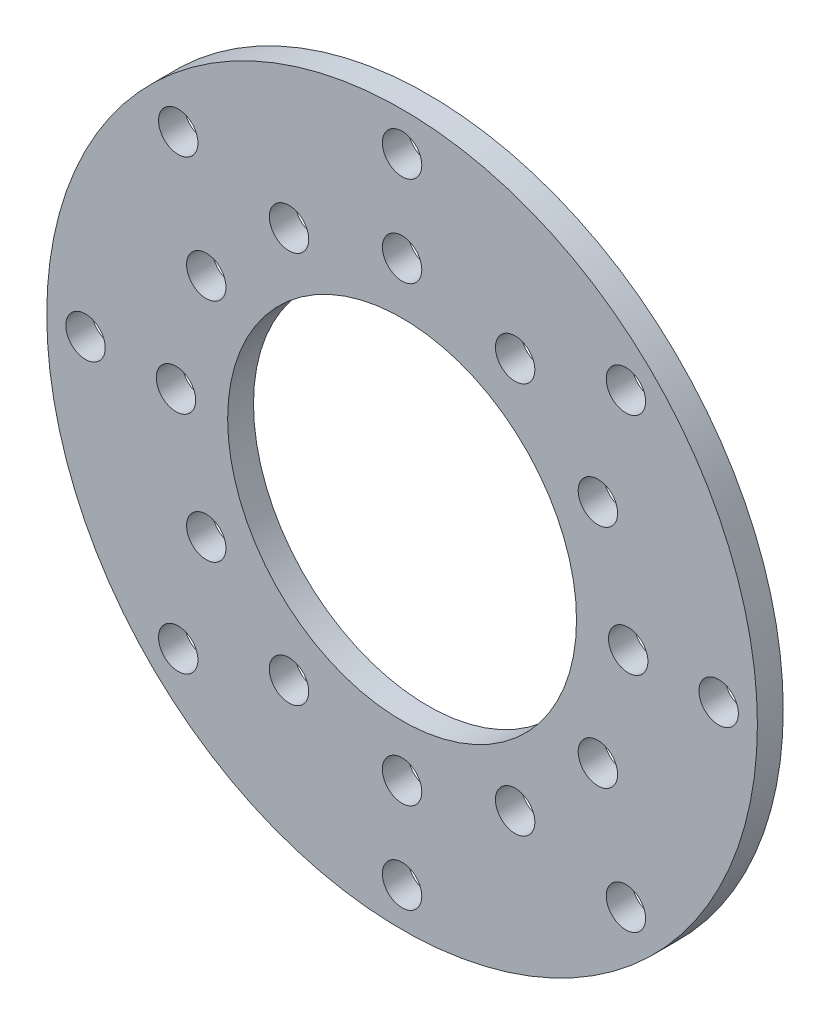
ISO-10303-21;
HEADER;
FILE_DESCRIPTION(('STEP AP214'),'2;1');
FILE_NAME('part.step','',(''),(''),'','','');
FILE_SCHEMA(('AUTOMOTIVE_DESIGN { 1 0 10303 214 1 1 1 1 }'));
ENDSEC;
DATA;
#1=APPLICATION_CONTEXT('core data for automotive mechanical design processes');
#2=APPLICATION_PROTOCOL_DEFINITION('international standard','automotive_design',2000,#1);
#3=PRODUCT_CONTEXT('',#1,'mechanical');
#4=PRODUCT('Part','Part','',(#3));
#5=PRODUCT_RELATED_PRODUCT_CATEGORY('part','',(#4));
#6=PRODUCT_DEFINITION_FORMATION('','',#4);
#7=PRODUCT_DEFINITION_CONTEXT('part definition',#1,'design');
#8=PRODUCT_DEFINITION('design','',#6,#7);
#9=PRODUCT_DEFINITION_SHAPE('','',#8);
#10=(LENGTH_UNIT() NAMED_UNIT(*) SI_UNIT(.MILLI.,.METRE.));
#11=(NAMED_UNIT(*) PLANE_ANGLE_UNIT() SI_UNIT($,.RADIAN.));
#12=(NAMED_UNIT(*) SI_UNIT($,.STERADIAN.) SOLID_ANGLE_UNIT());
#13=UNCERTAINTY_MEASURE_WITH_UNIT(LENGTH_MEASURE(1.E-05),#10,'distance_accuracy_value','');
#14=(GEOMETRIC_REPRESENTATION_CONTEXT(3) GLOBAL_UNCERTAINTY_ASSIGNED_CONTEXT((#13)) GLOBAL_UNIT_ASSIGNED_CONTEXT((#10,
#11,#12)) REPRESENTATION_CONTEXT('',''));
#15=CARTESIAN_POINT('',(0.,0.,0.));
#16=DIRECTION('',(0.,0.,1.));
#17=DIRECTION('',(1.,0.,0.));
#18=AXIS2_PLACEMENT_3D('',#15,#16,#17);
#19=CARTESIAN_POINT('',(0.,0.,2.));
#20=DIRECTION('',(0.,0.,1.));
#21=DIRECTION('',(1.,0.,0.));
#22=AXIS2_PLACEMENT_3D('',#19,#20,#21);
#23=PLANE('',#22);
#24=CARTESIAN_POINT('',(0.,24.5,2.));
#25=DIRECTION('',(0.,0.,1.));
#26=DIRECTION('',(1.,0.,0.));
#27=AXIS2_PLACEMENT_3D('',#24,#25,#26);
#28=CIRCLE('',#27,1.525);
#29=CARTESIAN_POINT('',(1.525,24.5,2.));
#30=VERTEX_POINT('',#29);
#31=EDGE_CURVE('E166',#30,#30,#28,.T.);
#32=ORIENTED_EDGE('',*,*,#31,.F.);
#33=EDGE_LOOP('',(#32));
#34=FACE_BOUND('',#33,.T.);
#35=CARTESIAN_POINT('',(17.3241161390707,17.3241161390701,2.));
#36=DIRECTION('',(0.,0.,1.));
#37=DIRECTION('',(1.,0.,0.));
#38=AXIS2_PLACEMENT_3D('',#35,#36,#37);
#39=CIRCLE('',#38,1.525);
#40=CARTESIAN_POINT('',(18.8491161390707,17.3241161390701,2.));
#41=VERTEX_POINT('',#40);
#42=EDGE_CURVE('E160',#41,#41,#39,.T.);
#43=ORIENTED_EDGE('',*,*,#42,.F.);
#44=EDGE_LOOP('',(#43));
#45=FACE_BOUND('',#44,.T.);
#46=CARTESIAN_POINT('',(24.5,-4.31946145518225E-13,2.));
#47=DIRECTION('',(0.,0.,1.));
#48=DIRECTION('',(1.,0.,0.));
#49=AXIS2_PLACEMENT_3D('',#46,#47,#48);
#50=CIRCLE('',#49,1.525);
#51=CARTESIAN_POINT('',(26.025,-4.31946145518225E-13,2.));
#52=VERTEX_POINT('',#51);
#53=EDGE_CURVE('E154',#52,#52,#50,.T.);
#54=ORIENTED_EDGE('',*,*,#53,.F.);
#55=EDGE_LOOP('',(#54));
#56=FACE_BOUND('',#55,.T.);
#57=CARTESIAN_POINT('',(17.3241161390701,-17.3241161390708,2.));
#58=DIRECTION('',(0.,0.,1.));
#59=DIRECTION('',(1.,0.,0.));
#60=AXIS2_PLACEMENT_3D('',#57,#58,#59);
#61=CIRCLE('',#60,1.525);
#62=CARTESIAN_POINT('',(18.8491161390701,-17.3241161390708,2.));
#63=VERTEX_POINT('',#62);
#64=EDGE_CURVE('E148',#63,#63,#61,.T.);
#65=ORIENTED_EDGE('',*,*,#64,.F.);
#66=EDGE_LOOP('',(#65));
#67=FACE_BOUND('',#66,.T.);
#68=CARTESIAN_POINT('',(-5.20417042793042E-13,-24.5,2.));
#69=DIRECTION('',(0.,0.,1.));
#70=DIRECTION('',(1.,0.,0.));
#71=AXIS2_PLACEMENT_3D('',#68,#69,#70);
#72=CIRCLE('',#71,1.525);
#73=CARTESIAN_POINT('',(1.52499999999948,-24.5,2.));
#74=VERTEX_POINT('',#73);
#75=EDGE_CURVE('E142',#74,#74,#72,.T.);
#76=ORIENTED_EDGE('',*,*,#75,.F.);
#77=EDGE_LOOP('',(#76));
#78=FACE_BOUND('',#77,.T.);
#79=CARTESIAN_POINT('',(-17.3241161390708,-17.32411613907,2.));
#80=DIRECTION('',(0.,0.,1.));
#81=DIRECTION('',(1.,0.,0.));
#82=AXIS2_PLACEMENT_3D('',#79,#80,#81);
#83=CIRCLE('',#82,1.525);
#84=CARTESIAN_POINT('',(-15.7991161390708,-17.32411613907,2.));
#85=VERTEX_POINT('',#84);
#86=EDGE_CURVE('E136',#85,#85,#83,.T.);
#87=ORIENTED_EDGE('',*,*,#86,.F.);
#88=EDGE_LOOP('',(#87));
#89=FACE_BOUND('',#88,.T.);
#90=CARTESIAN_POINT('',(-24.5,0.,2.));
#91=DIRECTION('',(0.,0.,1.));
#92=DIRECTION('',(1.,0.,0.));
#93=AXIS2_PLACEMENT_3D('',#90,#91,#92);
#94=CIRCLE('',#93,1.52499999999942);
#95=CARTESIAN_POINT('',(-22.9750000000006,0.,2.));
#96=VERTEX_POINT('',#95);
#97=EDGE_CURVE('E130',#96,#96,#94,.T.);
#98=ORIENTED_EDGE('',*,*,#97,.F.);
#99=EDGE_LOOP('',(#98));
#100=FACE_BOUND('',#99,.T.);
#101=CARTESIAN_POINT('',(-17.3241161390702,17.3241161390706,2.));
#102=DIRECTION('',(0.,0.,1.));
#103=DIRECTION('',(1.,0.,0.));
#104=AXIS2_PLACEMENT_3D('',#101,#102,#103);
#105=CIRCLE('',#104,1.525);
#106=CARTESIAN_POINT('',(-15.7991161390702,17.3241161390706,2.));
#107=VERTEX_POINT('',#106);
#108=EDGE_CURVE('E124',#107,#107,#105,.T.);
#109=ORIENTED_EDGE('',*,*,#108,.F.);
#110=EDGE_LOOP('',(#109));
#111=FACE_BOUND('',#110,.T.);
#112=CARTESIAN_POINT('',(-15.1554445662277,-8.75000000000001,2.));
#113=DIRECTION('',(0.,0.,1.));
#114=DIRECTION('',(1.,0.,0.));
#115=AXIS2_PLACEMENT_3D('',#112,#113,#114);
#116=CIRCLE('',#115,1.525);
#117=CARTESIAN_POINT('',(-13.6304445662277,-8.75000000000001,2.));
#118=VERTEX_POINT('',#117);
#119=EDGE_CURVE('E82',#118,#118,#116,.T.);
#120=ORIENTED_EDGE('',*,*,#119,.F.);
#121=EDGE_LOOP('',(#120));
#122=FACE_BOUND('',#121,.T.);
#123=CARTESIAN_POINT('',(-8.75,-15.1554445662277,2.));
#124=DIRECTION('',(0.,0.,1.));
#125=DIRECTION('',(1.,0.,0.));
#126=AXIS2_PLACEMENT_3D('',#123,#124,#125);
#127=CIRCLE('',#126,1.525);
#128=CARTESIAN_POINT('',(-7.225,-15.1554445662277,2.));
#129=VERTEX_POINT('',#128);
#130=EDGE_CURVE('E89',#129,#129,#127,.T.);
#131=ORIENTED_EDGE('',*,*,#130,.F.);
#132=EDGE_LOOP('',(#131));
#133=FACE_BOUND('',#132,.T.);
#134=CARTESIAN_POINT('',(0.,-17.5,2.));
#135=DIRECTION('',(0.,0.,1.));
#136=DIRECTION('',(1.,0.,0.));
#137=AXIS2_PLACEMENT_3D('',#134,#135,#136);
#138=CIRCLE('',#137,1.525);
#139=CARTESIAN_POINT('',(1.525,-17.5,2.));
#140=VERTEX_POINT('',#139);
#141=EDGE_CURVE('E95',#140,#140,#138,.T.);
#142=ORIENTED_EDGE('',*,*,#141,.F.);
#143=EDGE_LOOP('',(#142));
#144=FACE_BOUND('',#143,.T.);
#145=CARTESIAN_POINT('',(8.75000000000001,-15.1554445662277,2.));
#146=DIRECTION('',(0.,0.,1.));
#147=DIRECTION('',(1.,0.,0.));
#148=AXIS2_PLACEMENT_3D('',#145,#146,#147);
#149=CIRCLE('',#148,1.525);
#150=CARTESIAN_POINT('',(10.275,-15.1554445662277,2.));
#151=VERTEX_POINT('',#150);
#152=EDGE_CURVE('E101',#151,#151,#149,.T.);
#153=ORIENTED_EDGE('',*,*,#152,.F.);
#154=EDGE_LOOP('',(#153));
#155=FACE_BOUND('',#154,.T.);
#156=CARTESIAN_POINT('',(15.1554445662277,-8.75,2.));
#157=DIRECTION('',(0.,0.,1.));
#158=DIRECTION('',(1.,0.,0.));
#159=AXIS2_PLACEMENT_3D('',#156,#157,#158);
#160=CIRCLE('',#159,1.525);
#161=CARTESIAN_POINT('',(16.6804445662277,-8.75,2.));
#162=VERTEX_POINT('',#161);
#163=EDGE_CURVE('E58',#162,#162,#160,.T.);
#164=ORIENTED_EDGE('',*,*,#163,.F.);
#165=EDGE_LOOP('',(#164));
#166=FACE_BOUND('',#165,.T.);
#167=CARTESIAN_POINT('',(17.5,0.,2.));
#168=DIRECTION('',(0.,0.,1.));
#169=DIRECTION('',(1.,0.,0.));
#170=AXIS2_PLACEMENT_3D('',#167,#168,#169);
#171=CIRCLE('',#170,1.525);
#172=CARTESIAN_POINT('',(19.025,0.,2.));
#173=VERTEX_POINT('',#172);
#174=EDGE_CURVE('E65',#173,#173,#171,.T.);
#175=ORIENTED_EDGE('',*,*,#174,.F.);
#176=EDGE_LOOP('',(#175));
#177=FACE_BOUND('',#176,.T.);
#178=CARTESIAN_POINT('',(15.1554445662277,8.75,2.));
#179=DIRECTION('',(0.,0.,1.));
#180=DIRECTION('',(1.,0.,0.));
#181=AXIS2_PLACEMENT_3D('',#178,#179,#180);
#182=CIRCLE('',#181,1.525);
#183=CARTESIAN_POINT('',(16.6804445662277,8.75,2.));
#184=VERTEX_POINT('',#183);
#185=EDGE_CURVE('E71',#184,#184,#182,.T.);
#186=ORIENTED_EDGE('',*,*,#185,.F.);
#187=EDGE_LOOP('',(#186));
#188=FACE_BOUND('',#187,.T.);
#189=CARTESIAN_POINT('',(8.75000000000001,15.1554445662277,2.));
#190=DIRECTION('',(0.,0.,1.));
#191=DIRECTION('',(1.,0.,0.));
#192=AXIS2_PLACEMENT_3D('',#189,#190,#191);
#193=CIRCLE('',#192,1.525);
#194=CARTESIAN_POINT('',(10.275,15.1554445662277,2.));
#195=VERTEX_POINT('',#194);
#196=EDGE_CURVE('E77',#195,#195,#193,.T.);
#197=ORIENTED_EDGE('',*,*,#196,.F.);
#198=EDGE_LOOP('',(#197));
#199=FACE_BOUND('',#198,.T.);
#200=CARTESIAN_POINT('',(-17.5,0.,2.));
#201=DIRECTION('',(0.,0.,1.));
#202=DIRECTION('',(1.,0.,0.));
#203=AXIS2_PLACEMENT_3D('',#200,#201,#202);
#204=CIRCLE('',#203,1.525);
#205=CARTESIAN_POINT('',(-15.975,0.,2.));
#206=VERTEX_POINT('',#205);
#207=EDGE_CURVE('E119',#206,#206,#204,.T.);
#208=ORIENTED_EDGE('',*,*,#207,.F.);
#209=EDGE_LOOP('',(#208));
#210=FACE_BOUND('',#209,.T.);
#211=CARTESIAN_POINT('',(-15.1554445662277,8.74999999999999,2.));
#212=DIRECTION('',(0.,0.,1.));
#213=DIRECTION('',(1.,0.,0.));
#214=AXIS2_PLACEMENT_3D('',#211,#212,#213);
#215=CIRCLE('',#214,1.525);
#216=CARTESIAN_POINT('',(-13.6304445662277,8.74999999999999,2.));
#217=VERTEX_POINT('',#216);
#218=EDGE_CURVE('E113',#217,#217,#215,.T.);
#219=ORIENTED_EDGE('',*,*,#218,.F.);
#220=EDGE_LOOP('',(#219));
#221=FACE_BOUND('',#220,.T.);
#222=CARTESIAN_POINT('',(-8.75000000000001,15.1554445662277,2.));
#223=DIRECTION('',(0.,0.,1.));
#224=DIRECTION('',(1.,0.,0.));
#225=AXIS2_PLACEMENT_3D('',#222,#223,#224);
#226=CIRCLE('',#225,1.525);
#227=CARTESIAN_POINT('',(-7.22500000000001,15.1554445662277,2.));
#228=VERTEX_POINT('',#227);
#229=EDGE_CURVE('E106',#228,#228,#226,.T.);
#230=ORIENTED_EDGE('',*,*,#229,.F.);
#231=EDGE_LOOP('',(#230));
#232=FACE_BOUND('',#231,.T.);
#233=CARTESIAN_POINT('',(0.,17.5,2.));
#234=DIRECTION('',(0.,0.,1.));
#235=DIRECTION('',(1.,0.,0.));
#236=AXIS2_PLACEMENT_3D('',#233,#234,#235);
#237=CIRCLE('',#236,1.525);
#238=CARTESIAN_POINT('',(1.525,17.5,2.));
#239=VERTEX_POINT('',#238);
#240=EDGE_CURVE('E52',#239,#239,#237,.T.);
#241=ORIENTED_EDGE('',*,*,#240,.F.);
#242=EDGE_LOOP('',(#241));
#243=FACE_BOUND('',#242,.T.);
#244=CARTESIAN_POINT('',(0.,0.,2.));
#245=DIRECTION('',(0.,0.,1.));
#246=DIRECTION('',(1.,0.,0.));
#247=AXIS2_PLACEMENT_3D('',#244,#245,#246);
#248=CIRCLE('',#247,27.5);
#249=CARTESIAN_POINT('',(27.5,0.,2.));
#250=VERTEX_POINT('',#249);
#251=EDGE_CURVE('E10',#250,#250,#248,.T.);
#252=ORIENTED_EDGE('',*,*,#251,.T.);
#253=EDGE_LOOP('',(#252));
#254=FACE_BOUND('',#253,.T.);
#255=CARTESIAN_POINT('',(0.,0.,2.));
#256=DIRECTION('',(0.,0.,1.));
#257=DIRECTION('',(1.,0.,0.));
#258=AXIS2_PLACEMENT_3D('',#255,#256,#257);
#259=CIRCLE('',#258,13.5);
#260=CARTESIAN_POINT('',(13.5,0.,2.));
#261=VERTEX_POINT('',#260);
#262=EDGE_CURVE('E44',#261,#261,#259,.T.);
#263=ORIENTED_EDGE('',*,*,#262,.F.);
#264=EDGE_LOOP('',(#263));
#265=FACE_BOUND('',#264,.T.);
#266=ADVANCED_FACE('F33',(#34,#45,#56,#67,#78,#89,#100,#111,#122,#133,#144,#155,#166,#177,#188,
#199,#210,#221,#232,#243,#254,#265),#23,.T.);
#267=CARTESIAN_POINT('',(0.,0.,0.));
#268=DIRECTION('',(0.,0.,1.));
#269=DIRECTION('',(1.,0.,0.));
#270=AXIS2_PLACEMENT_3D('',#267,#268,#269);
#271=PLANE('',#270);
#272=CARTESIAN_POINT('',(0.,24.5,0.));
#273=DIRECTION('',(0.,0.,1.));
#274=DIRECTION('',(1.,0.,0.));
#275=AXIS2_PLACEMENT_3D('',#272,#273,#274);
#276=CIRCLE('',#275,1.525);
#277=CARTESIAN_POINT('',(1.525,24.5,0.));
#278=VERTEX_POINT('',#277);
#279=EDGE_CURVE('E110',#278,#278,#276,.T.);
#280=ORIENTED_EDGE('',*,*,#279,.T.);
#281=EDGE_LOOP('',(#280));
#282=FACE_BOUND('',#281,.T.);
#283=CARTESIAN_POINT('',(17.3241161390707,17.3241161390701,0.));
#284=DIRECTION('',(0.,0.,1.));
#285=DIRECTION('',(1.,0.,0.));
#286=AXIS2_PLACEMENT_3D('',#283,#284,#285);
#287=CIRCLE('',#286,1.525);
#288=CARTESIAN_POINT('',(18.8491161390707,17.3241161390701,0.));
#289=VERTEX_POINT('',#288);
#290=EDGE_CURVE('E163',#289,#289,#287,.T.);
#291=ORIENTED_EDGE('',*,*,#290,.T.);
#292=EDGE_LOOP('',(#291));
#293=FACE_BOUND('',#292,.T.);
#294=CARTESIAN_POINT('',(24.5,-4.31946145518225E-13,0.));
#295=DIRECTION('',(0.,0.,1.));
#296=DIRECTION('',(1.,0.,0.));
#297=AXIS2_PLACEMENT_3D('',#294,#295,#296);
#298=CIRCLE('',#297,1.525);
#299=CARTESIAN_POINT('',(26.025,-4.31946145518225E-13,0.));
#300=VERTEX_POINT('',#299);
#301=EDGE_CURVE('E157',#300,#300,#298,.T.);
#302=ORIENTED_EDGE('',*,*,#301,.T.);
#303=EDGE_LOOP('',(#302));
#304=FACE_BOUND('',#303,.T.);
#305=CARTESIAN_POINT('',(17.3241161390701,-17.3241161390708,0.));
#306=DIRECTION('',(0.,0.,1.));
#307=DIRECTION('',(1.,0.,0.));
#308=AXIS2_PLACEMENT_3D('',#305,#306,#307);
#309=CIRCLE('',#308,1.525);
#310=CARTESIAN_POINT('',(18.8491161390701,-17.3241161390708,0.));
#311=VERTEX_POINT('',#310);
#312=EDGE_CURVE('E151',#311,#311,#309,.T.);
#313=ORIENTED_EDGE('',*,*,#312,.T.);
#314=EDGE_LOOP('',(#313));
#315=FACE_BOUND('',#314,.T.);
#316=CARTESIAN_POINT('',(-5.20417042793042E-13,-24.5,0.));
#317=DIRECTION('',(0.,0.,1.));
#318=DIRECTION('',(1.,0.,0.));
#319=AXIS2_PLACEMENT_3D('',#316,#317,#318);
#320=CIRCLE('',#319,1.525);
#321=CARTESIAN_POINT('',(1.52499999999948,-24.5,0.));
#322=VERTEX_POINT('',#321);
#323=EDGE_CURVE('E145',#322,#322,#320,.T.);
#324=ORIENTED_EDGE('',*,*,#323,.T.);
#325=EDGE_LOOP('',(#324));
#326=FACE_BOUND('',#325,.T.);
#327=CARTESIAN_POINT('',(-17.3241161390708,-17.32411613907,0.));
#328=DIRECTION('',(0.,0.,1.));
#329=DIRECTION('',(1.,0.,0.));
#330=AXIS2_PLACEMENT_3D('',#327,#328,#329);
#331=CIRCLE('',#330,1.525);
#332=CARTESIAN_POINT('',(-15.7991161390708,-17.32411613907,0.));
#333=VERTEX_POINT('',#332);
#334=EDGE_CURVE('E139',#333,#333,#331,.T.);
#335=ORIENTED_EDGE('',*,*,#334,.T.);
#336=EDGE_LOOP('',(#335));
#337=FACE_BOUND('',#336,.T.);
#338=CARTESIAN_POINT('',(-24.5,0.,0.));
#339=DIRECTION('',(0.,0.,1.));
#340=DIRECTION('',(1.,0.,0.));
#341=AXIS2_PLACEMENT_3D('',#338,#339,#340);
#342=CIRCLE('',#341,1.52499999999942);
#343=CARTESIAN_POINT('',(-22.9750000000006,0.,0.));
#344=VERTEX_POINT('',#343);
#345=EDGE_CURVE('E133',#344,#344,#342,.T.);
#346=ORIENTED_EDGE('',*,*,#345,.T.);
#347=EDGE_LOOP('',(#346));
#348=FACE_BOUND('',#347,.T.);
#349=CARTESIAN_POINT('',(-17.3241161390702,17.3241161390706,0.));
#350=DIRECTION('',(0.,0.,1.));
#351=DIRECTION('',(1.,0.,0.));
#352=AXIS2_PLACEMENT_3D('',#349,#350,#351);
#353=CIRCLE('',#352,1.525);
#354=CARTESIAN_POINT('',(-15.7991161390702,17.3241161390706,0.));
#355=VERTEX_POINT('',#354);
#356=EDGE_CURVE('E127',#355,#355,#353,.T.);
#357=ORIENTED_EDGE('',*,*,#356,.T.);
#358=EDGE_LOOP('',(#357));
#359=FACE_BOUND('',#358,.T.);
#360=CARTESIAN_POINT('',(-15.1554445662277,-8.75000000000001,0.));
#361=DIRECTION('',(0.,0.,1.));
#362=DIRECTION('',(1.,0.,0.));
#363=AXIS2_PLACEMENT_3D('',#360,#361,#362);
#364=CIRCLE('',#363,1.525);
#365=CARTESIAN_POINT('',(-13.6304445662277,-8.75000000000001,0.));
#366=VERTEX_POINT('',#365);
#367=EDGE_CURVE('E85',#366,#366,#364,.T.);
#368=ORIENTED_EDGE('',*,*,#367,.T.);
#369=EDGE_LOOP('',(#368));
#370=FACE_BOUND('',#369,.T.);
#371=CARTESIAN_POINT('',(-8.75,-15.1554445662277,0.));
#372=DIRECTION('',(0.,0.,1.));
#373=DIRECTION('',(1.,0.,0.));
#374=AXIS2_PLACEMENT_3D('',#371,#372,#373);
#375=CIRCLE('',#374,1.525);
#376=CARTESIAN_POINT('',(-7.225,-15.1554445662277,0.));
#377=VERTEX_POINT('',#376);
#378=EDGE_CURVE('E92',#377,#377,#375,.T.);
#379=ORIENTED_EDGE('',*,*,#378,.T.);
#380=EDGE_LOOP('',(#379));
#381=FACE_BOUND('',#380,.T.);
#382=CARTESIAN_POINT('',(0.,-17.5,0.));
#383=DIRECTION('',(0.,0.,1.));
#384=DIRECTION('',(1.,0.,0.));
#385=AXIS2_PLACEMENT_3D('',#382,#383,#384);
#386=CIRCLE('',#385,1.525);
#387=CARTESIAN_POINT('',(1.525,-17.5,0.));
#388=VERTEX_POINT('',#387);
#389=EDGE_CURVE('E98',#388,#388,#386,.T.);
#390=ORIENTED_EDGE('',*,*,#389,.T.);
#391=EDGE_LOOP('',(#390));
#392=FACE_BOUND('',#391,.T.);
#393=CARTESIAN_POINT('',(8.75000000000001,-15.1554445662277,0.));
#394=DIRECTION('',(0.,0.,1.));
#395=DIRECTION('',(1.,0.,0.));
#396=AXIS2_PLACEMENT_3D('',#393,#394,#395);
#397=CIRCLE('',#396,1.525);
#398=CARTESIAN_POINT('',(10.275,-15.1554445662277,0.));
#399=VERTEX_POINT('',#398);
#400=EDGE_CURVE('E62',#399,#399,#397,.T.);
#401=ORIENTED_EDGE('',*,*,#400,.T.);
#402=EDGE_LOOP('',(#401));
#403=FACE_BOUND('',#402,.T.);
#404=CARTESIAN_POINT('',(15.1554445662277,-8.75,0.));
#405=DIRECTION('',(0.,0.,1.));
#406=DIRECTION('',(1.,0.,0.));
#407=AXIS2_PLACEMENT_3D('',#404,#405,#406);
#408=CIRCLE('',#407,1.525);
#409=CARTESIAN_POINT('',(16.6804445662277,-8.75,0.));
#410=VERTEX_POINT('',#409);
#411=EDGE_CURVE('E61',#410,#410,#408,.T.);
#412=ORIENTED_EDGE('',*,*,#411,.T.);
#413=EDGE_LOOP('',(#412));
#414=FACE_BOUND('',#413,.T.);
#415=CARTESIAN_POINT('',(17.5,0.,0.));
#416=DIRECTION('',(0.,0.,1.));
#417=DIRECTION('',(1.,0.,0.));
#418=AXIS2_PLACEMENT_3D('',#415,#416,#417);
#419=CIRCLE('',#418,1.525);
#420=CARTESIAN_POINT('',(19.025,0.,0.));
#421=VERTEX_POINT('',#420);
#422=EDGE_CURVE('E68',#421,#421,#419,.T.);
#423=ORIENTED_EDGE('',*,*,#422,.T.);
#424=EDGE_LOOP('',(#423));
#425=FACE_BOUND('',#424,.T.);
#426=CARTESIAN_POINT('',(15.1554445662277,8.75,0.));
#427=DIRECTION('',(0.,0.,1.));
#428=DIRECTION('',(1.,0.,0.));
#429=AXIS2_PLACEMENT_3D('',#426,#427,#428);
#430=CIRCLE('',#429,1.525);
#431=CARTESIAN_POINT('',(16.6804445662277,8.75,0.));
#432=VERTEX_POINT('',#431);
#433=EDGE_CURVE('E74',#432,#432,#430,.T.);
#434=ORIENTED_EDGE('',*,*,#433,.T.);
#435=EDGE_LOOP('',(#434));
#436=FACE_BOUND('',#435,.T.);
#437=CARTESIAN_POINT('',(8.75000000000001,15.1554445662277,0.));
#438=DIRECTION('',(0.,0.,1.));
#439=DIRECTION('',(1.,0.,0.));
#440=AXIS2_PLACEMENT_3D('',#437,#438,#439);
#441=CIRCLE('',#440,1.525);
#442=CARTESIAN_POINT('',(10.275,15.1554445662277,0.));
#443=VERTEX_POINT('',#442);
#444=EDGE_CURVE('E55',#443,#443,#441,.T.);
#445=ORIENTED_EDGE('',*,*,#444,.T.);
#446=EDGE_LOOP('',(#445));
#447=FACE_BOUND('',#446,.T.);
#448=CARTESIAN_POINT('',(-17.5,0.,0.));
#449=DIRECTION('',(0.,0.,1.));
#450=DIRECTION('',(1.,0.,0.));
#451=AXIS2_PLACEMENT_3D('',#448,#449,#450);
#452=CIRCLE('',#451,1.525);
#453=CARTESIAN_POINT('',(-15.975,0.,0.));
#454=VERTEX_POINT('',#453);
#455=EDGE_CURVE('E86',#454,#454,#452,.T.);
#456=ORIENTED_EDGE('',*,*,#455,.T.);
#457=EDGE_LOOP('',(#456));
#458=FACE_BOUND('',#457,.T.);
#459=CARTESIAN_POINT('',(-15.1554445662277,8.74999999999999,0.));
#460=DIRECTION('',(0.,0.,1.));
#461=DIRECTION('',(1.,0.,0.));
#462=AXIS2_PLACEMENT_3D('',#459,#460,#461);
#463=CIRCLE('',#462,1.525);
#464=CARTESIAN_POINT('',(-13.6304445662277,8.74999999999999,0.));
#465=VERTEX_POINT('',#464);
#466=EDGE_CURVE('E116',#465,#465,#463,.T.);
#467=ORIENTED_EDGE('',*,*,#466,.T.);
#468=EDGE_LOOP('',(#467));
#469=FACE_BOUND('',#468,.T.);
#470=CARTESIAN_POINT('',(-8.75000000000001,15.1554445662277,0.));
#471=DIRECTION('',(0.,0.,1.));
#472=DIRECTION('',(1.,0.,0.));
#473=AXIS2_PLACEMENT_3D('',#470,#471,#472);
#474=CIRCLE('',#473,1.525);
#475=CARTESIAN_POINT('',(-7.22500000000001,15.1554445662277,0.));
#476=VERTEX_POINT('',#475);
#477=EDGE_CURVE('E109',#476,#476,#474,.T.);
#478=ORIENTED_EDGE('',*,*,#477,.T.);
#479=EDGE_LOOP('',(#478));
#480=FACE_BOUND('',#479,.T.);
#481=CARTESIAN_POINT('',(0.,17.5,0.));
#482=DIRECTION('',(0.,0.,1.));
#483=DIRECTION('',(1.,0.,0.));
#484=AXIS2_PLACEMENT_3D('',#481,#482,#483);
#485=CIRCLE('',#484,1.525);
#486=CARTESIAN_POINT('',(1.525,17.5,0.));
#487=VERTEX_POINT('',#486);
#488=EDGE_CURVE('E49',#487,#487,#485,.T.);
#489=ORIENTED_EDGE('',*,*,#488,.T.);
#490=EDGE_LOOP('',(#489));
#491=FACE_BOUND('',#490,.T.);
#492=CARTESIAN_POINT('',(0.,0.,0.));
#493=DIRECTION('',(0.,0.,1.));
#494=DIRECTION('',(1.,0.,0.));
#495=AXIS2_PLACEMENT_3D('',#492,#493,#494);
#496=CIRCLE('',#495,27.5);
#497=CARTESIAN_POINT('',(27.5,0.,0.));
#498=VERTEX_POINT('',#497);
#499=EDGE_CURVE('E37',#498,#498,#496,.T.);
#500=ORIENTED_EDGE('',*,*,#499,.F.);
#501=EDGE_LOOP('',(#500));
#502=FACE_BOUND('',#501,.T.);
#503=CARTESIAN_POINT('',(0.,0.,0.));
#504=DIRECTION('',(0.,0.,1.));
#505=DIRECTION('',(1.,0.,0.));
#506=AXIS2_PLACEMENT_3D('',#503,#504,#505);
#507=CIRCLE('',#506,13.5);
#508=CARTESIAN_POINT('',(13.5,0.,0.));
#509=VERTEX_POINT('',#508);
#510=EDGE_CURVE('E46',#509,#509,#507,.T.);
#511=ORIENTED_EDGE('',*,*,#510,.T.);
#512=EDGE_LOOP('',(#511));
#513=FACE_BOUND('',#512,.T.);
#514=ADVANCED_FACE('F172',(#282,#293,#304,#315,#326,#337,#348,#359,#370,#381,#392,#403,#414,
#425,#436,#447,#458,#469,#480,#491,#502,#513),#271,.F.);
#515=CARTESIAN_POINT('',(0.,0.,2.));
#516=DIRECTION('',(0.,0.,-1.));
#517=DIRECTION('',(-1.,0.,0.));
#518=AXIS2_PLACEMENT_3D('',#515,#516,#517);
#519=CYLINDRICAL_SURFACE('',#518,27.5);
#520=ORIENTED_EDGE('',*,*,#251,.F.);
#521=EDGE_LOOP('',(#520));
#522=FACE_BOUND('',#521,.T.);
#523=ORIENTED_EDGE('',*,*,#499,.T.);
#524=EDGE_LOOP('',(#523));
#525=FACE_BOUND('',#524,.T.);
#526=ADVANCED_FACE('F35',(#522,#525),#519,.T.);
#527=CARTESIAN_POINT('',(0.,0.,2.));
#528=DIRECTION('',(0.,0.,-1.));
#529=DIRECTION('',(-1.,0.,0.));
#530=AXIS2_PLACEMENT_3D('',#527,#528,#529);
#531=CYLINDRICAL_SURFACE('',#530,13.5);
#532=ORIENTED_EDGE('',*,*,#262,.T.);
#533=EDGE_LOOP('',(#532));
#534=FACE_BOUND('',#533,.T.);
#535=ORIENTED_EDGE('',*,*,#510,.F.);
#536=EDGE_LOOP('',(#535));
#537=FACE_BOUND('',#536,.T.);
#538=ADVANCED_FACE('F225',(#534,#537),#531,.F.);
#539=CARTESIAN_POINT('',(0.,17.5,0.));
#540=DIRECTION('',(0.,0.,1.));
#541=DIRECTION('',(1.,0.,0.));
#542=AXIS2_PLACEMENT_3D('',#539,#540,#541);
#543=CYLINDRICAL_SURFACE('',#542,1.525);
#544=ORIENTED_EDGE('',*,*,#488,.F.);
#545=EDGE_LOOP('',(#544));
#546=FACE_BOUND('',#545,.T.);
#547=ORIENTED_EDGE('',*,*,#240,.T.);
#548=EDGE_LOOP('',(#547));
#549=FACE_BOUND('',#548,.T.);
#550=ADVANCED_FACE('F228',(#546,#549),#543,.F.);
#551=CARTESIAN_POINT('',(-8.75000000000001,15.1554445662277,0.));
#552=DIRECTION('',(0.,0.,1.));
#553=DIRECTION('',(1.,0.,0.));
#554=AXIS2_PLACEMENT_3D('',#551,#552,#553);
#555=CYLINDRICAL_SURFACE('',#554,1.525);
#556=ORIENTED_EDGE('',*,*,#477,.F.);
#557=EDGE_LOOP('',(#556));
#558=FACE_BOUND('',#557,.T.);
#559=ORIENTED_EDGE('',*,*,#229,.T.);
#560=EDGE_LOOP('',(#559));
#561=FACE_BOUND('',#560,.T.);
#562=ADVANCED_FACE('F240',(#558,#561),#555,.F.);
#563=CARTESIAN_POINT('',(-15.1554445662277,8.74999999999999,0.));
#564=DIRECTION('',(0.,0.,1.));
#565=DIRECTION('',(1.,0.,0.));
#566=AXIS2_PLACEMENT_3D('',#563,#564,#565);
#567=CYLINDRICAL_SURFACE('',#566,1.525);
#568=ORIENTED_EDGE('',*,*,#466,.F.);
#569=EDGE_LOOP('',(#568));
#570=FACE_BOUND('',#569,.T.);
#571=ORIENTED_EDGE('',*,*,#218,.T.);
#572=EDGE_LOOP('',(#571));
#573=FACE_BOUND('',#572,.T.);
#574=ADVANCED_FACE('F278',(#570,#573),#567,.F.);
#575=CARTESIAN_POINT('',(-17.5,0.,0.));
#576=DIRECTION('',(0.,0.,1.));
#577=DIRECTION('',(1.,0.,0.));
#578=AXIS2_PLACEMENT_3D('',#575,#576,#577);
#579=CYLINDRICAL_SURFACE('',#578,1.525);
#580=ORIENTED_EDGE('',*,*,#455,.F.);
#581=EDGE_LOOP('',(#580));
#582=FACE_BOUND('',#581,.T.);
#583=ORIENTED_EDGE('',*,*,#207,.T.);
#584=EDGE_LOOP('',(#583));
#585=FACE_BOUND('',#584,.T.);
#586=ADVANCED_FACE('F258',(#582,#585),#579,.F.);
#587=CARTESIAN_POINT('',(8.75000000000001,15.1554445662277,0.));
#588=DIRECTION('',(0.,0.,1.));
#589=DIRECTION('',(1.,0.,0.));
#590=AXIS2_PLACEMENT_3D('',#587,#588,#589);
#591=CYLINDRICAL_SURFACE('',#590,1.525);
#592=ORIENTED_EDGE('',*,*,#444,.F.);
#593=EDGE_LOOP('',(#592));
#594=FACE_BOUND('',#593,.T.);
#595=ORIENTED_EDGE('',*,*,#196,.T.);
#596=EDGE_LOOP('',(#595));
#597=FACE_BOUND('',#596,.T.);
#598=ADVANCED_FACE('F254',(#594,#597),#591,.F.);
#599=CARTESIAN_POINT('',(15.1554445662277,8.75,0.));
#600=DIRECTION('',(0.,0.,1.));
#601=DIRECTION('',(1.,0.,0.));
#602=AXIS2_PLACEMENT_3D('',#599,#600,#601);
#603=CYLINDRICAL_SURFACE('',#602,1.525);
#604=ORIENTED_EDGE('',*,*,#433,.F.);
#605=EDGE_LOOP('',(#604));
#606=FACE_BOUND('',#605,.T.);
#607=ORIENTED_EDGE('',*,*,#185,.T.);
#608=EDGE_LOOP('',(#607));
#609=FACE_BOUND('',#608,.T.);
#610=ADVANCED_FACE('F250',(#606,#609),#603,.F.);
#611=CARTESIAN_POINT('',(17.5,0.,0.));
#612=DIRECTION('',(0.,0.,1.));
#613=DIRECTION('',(1.,0.,0.));
#614=AXIS2_PLACEMENT_3D('',#611,#612,#613);
#615=CYLINDRICAL_SURFACE('',#614,1.525);
#616=ORIENTED_EDGE('',*,*,#422,.F.);
#617=EDGE_LOOP('',(#616));
#618=FACE_BOUND('',#617,.T.);
#619=ORIENTED_EDGE('',*,*,#174,.T.);
#620=EDGE_LOOP('',(#619));
#621=FACE_BOUND('',#620,.T.);
#622=ADVANCED_FACE('F246',(#618,#621),#615,.F.);
#623=CARTESIAN_POINT('',(15.1554445662277,-8.75,0.));
#624=DIRECTION('',(0.,0.,1.));
#625=DIRECTION('',(1.,0.,0.));
#626=AXIS2_PLACEMENT_3D('',#623,#624,#625);
#627=CYLINDRICAL_SURFACE('',#626,1.525);
#628=ORIENTED_EDGE('',*,*,#411,.F.);
#629=EDGE_LOOP('',(#628));
#630=FACE_BOUND('',#629,.T.);
#631=ORIENTED_EDGE('',*,*,#163,.T.);
#632=EDGE_LOOP('',(#631));
#633=FACE_BOUND('',#632,.T.);
#634=ADVANCED_FACE('F242',(#630,#633),#627,.F.);
#635=CARTESIAN_POINT('',(8.75000000000001,-15.1554445662277,0.));
#636=DIRECTION('',(0.,0.,1.));
#637=DIRECTION('',(1.,0.,0.));
#638=AXIS2_PLACEMENT_3D('',#635,#636,#637);
#639=CYLINDRICAL_SURFACE('',#638,1.525);
#640=ORIENTED_EDGE('',*,*,#400,.F.);
#641=EDGE_LOOP('',(#640));
#642=FACE_BOUND('',#641,.T.);
#643=ORIENTED_EDGE('',*,*,#152,.T.);
#644=EDGE_LOOP('',(#643));
#645=FACE_BOUND('',#644,.T.);
#646=ADVANCED_FACE('F245',(#642,#645),#639,.F.);
#647=CARTESIAN_POINT('',(0.,-17.5,0.));
#648=DIRECTION('',(0.,0.,1.));
#649=DIRECTION('',(1.,0.,0.));
#650=AXIS2_PLACEMENT_3D('',#647,#648,#649);
#651=CYLINDRICAL_SURFACE('',#650,1.525);
#652=ORIENTED_EDGE('',*,*,#389,.F.);
#653=EDGE_LOOP('',(#652));
#654=FACE_BOUND('',#653,.T.);
#655=ORIENTED_EDGE('',*,*,#141,.T.);
#656=EDGE_LOOP('',(#655));
#657=FACE_BOUND('',#656,.T.);
#658=ADVANCED_FACE('F268',(#654,#657),#651,.F.);
#659=CARTESIAN_POINT('',(-8.75,-15.1554445662277,0.));
#660=DIRECTION('',(0.,0.,1.));
#661=DIRECTION('',(1.,0.,0.));
#662=AXIS2_PLACEMENT_3D('',#659,#660,#661);
#663=CYLINDRICAL_SURFACE('',#662,1.525);
#664=ORIENTED_EDGE('',*,*,#378,.F.);
#665=EDGE_LOOP('',(#664));
#666=FACE_BOUND('',#665,.T.);
#667=ORIENTED_EDGE('',*,*,#130,.T.);
#668=EDGE_LOOP('',(#667));
#669=FACE_BOUND('',#668,.T.);
#670=ADVANCED_FACE('F264',(#666,#669),#663,.F.);
#671=CARTESIAN_POINT('',(-15.1554445662277,-8.75000000000001,0.));
#672=DIRECTION('',(0.,0.,1.));
#673=DIRECTION('',(1.,0.,0.));
#674=AXIS2_PLACEMENT_3D('',#671,#672,#673);
#675=CYLINDRICAL_SURFACE('',#674,1.525);
#676=ORIENTED_EDGE('',*,*,#367,.F.);
#677=EDGE_LOOP('',(#676));
#678=FACE_BOUND('',#677,.T.);
#679=ORIENTED_EDGE('',*,*,#119,.T.);
#680=EDGE_LOOP('',(#679));
#681=FACE_BOUND('',#680,.T.);
#682=ADVANCED_FACE('F260',(#678,#681),#675,.F.);
#683=CARTESIAN_POINT('',(-17.3241161390702,17.3241161390706,0.));
#684=DIRECTION('',(0.,0.,1.));
#685=DIRECTION('',(1.,0.,0.));
#686=AXIS2_PLACEMENT_3D('',#683,#684,#685);
#687=CYLINDRICAL_SURFACE('',#686,1.525);
#688=ORIENTED_EDGE('',*,*,#356,.F.);
#689=EDGE_LOOP('',(#688));
#690=FACE_BOUND('',#689,.T.);
#691=ORIENTED_EDGE('',*,*,#108,.T.);
#692=EDGE_LOOP('',(#691));
#693=FACE_BOUND('',#692,.T.);
#694=ADVANCED_FACE('F263',(#690,#693),#687,.F.);
#695=CARTESIAN_POINT('',(-24.5,0.,0.));
#696=DIRECTION('',(0.,0.,1.));
#697=DIRECTION('',(1.,0.,0.));
#698=AXIS2_PLACEMENT_3D('',#695,#696,#697);
#699=CYLINDRICAL_SURFACE('',#698,1.52499999999942);
#700=ORIENTED_EDGE('',*,*,#345,.F.);
#701=EDGE_LOOP('',(#700));
#702=FACE_BOUND('',#701,.T.);
#703=ORIENTED_EDGE('',*,*,#97,.T.);
#704=EDGE_LOOP('',(#703));
#705=FACE_BOUND('',#704,.T.);
#706=ADVANCED_FACE('F288',(#702,#705),#699,.F.);
#707=CARTESIAN_POINT('',(-17.3241161390708,-17.32411613907,0.));
#708=DIRECTION('',(0.,0.,1.));
#709=DIRECTION('',(1.,0.,0.));
#710=AXIS2_PLACEMENT_3D('',#707,#708,#709);
#711=CYLINDRICAL_SURFACE('',#710,1.525);
#712=ORIENTED_EDGE('',*,*,#334,.F.);
#713=EDGE_LOOP('',(#712));
#714=FACE_BOUND('',#713,.T.);
#715=ORIENTED_EDGE('',*,*,#86,.T.);
#716=EDGE_LOOP('',(#715));
#717=FACE_BOUND('',#716,.T.);
#718=ADVANCED_FACE('F292',(#714,#717),#711,.F.);
#719=CARTESIAN_POINT('',(-5.20417042793042E-13,-24.5,0.));
#720=DIRECTION('',(0.,0.,1.));
#721=DIRECTION('',(1.,0.,0.));
#722=AXIS2_PLACEMENT_3D('',#719,#720,#721);
#723=CYLINDRICAL_SURFACE('',#722,1.525);
#724=ORIENTED_EDGE('',*,*,#323,.F.);
#725=EDGE_LOOP('',(#724));
#726=FACE_BOUND('',#725,.T.);
#727=ORIENTED_EDGE('',*,*,#75,.T.);
#728=EDGE_LOOP('',(#727));
#729=FACE_BOUND('',#728,.T.);
#730=ADVANCED_FACE('F296',(#726,#729),#723,.F.);
#731=CARTESIAN_POINT('',(17.3241161390701,-17.3241161390708,0.));
#732=DIRECTION('',(0.,0.,1.));
#733=DIRECTION('',(1.,0.,0.));
#734=AXIS2_PLACEMENT_3D('',#731,#732,#733);
#735=CYLINDRICAL_SURFACE('',#734,1.525);
#736=ORIENTED_EDGE('',*,*,#312,.F.);
#737=EDGE_LOOP('',(#736));
#738=FACE_BOUND('',#737,.T.);
#739=ORIENTED_EDGE('',*,*,#64,.T.);
#740=EDGE_LOOP('',(#739));
#741=FACE_BOUND('',#740,.T.);
#742=ADVANCED_FACE('F300',(#738,#741),#735,.F.);
#743=CARTESIAN_POINT('',(24.5,-4.31946145518225E-13,0.));
#744=DIRECTION('',(0.,0.,1.));
#745=DIRECTION('',(1.,0.,0.));
#746=AXIS2_PLACEMENT_3D('',#743,#744,#745);
#747=CYLINDRICAL_SURFACE('',#746,1.525);
#748=ORIENTED_EDGE('',*,*,#301,.F.);
#749=EDGE_LOOP('',(#748));
#750=FACE_BOUND('',#749,.T.);
#751=ORIENTED_EDGE('',*,*,#53,.T.);
#752=EDGE_LOOP('',(#751));
#753=FACE_BOUND('',#752,.T.);
#754=ADVANCED_FACE('F304',(#750,#753),#747,.F.);
#755=CARTESIAN_POINT('',(17.3241161390707,17.3241161390701,0.));
#756=DIRECTION('',(0.,0.,1.));
#757=DIRECTION('',(1.,0.,0.));
#758=AXIS2_PLACEMENT_3D('',#755,#756,#757);
#759=CYLINDRICAL_SURFACE('',#758,1.525);
#760=ORIENTED_EDGE('',*,*,#290,.F.);
#761=EDGE_LOOP('',(#760));
#762=FACE_BOUND('',#761,.T.);
#763=ORIENTED_EDGE('',*,*,#42,.T.);
#764=EDGE_LOOP('',(#763));
#765=FACE_BOUND('',#764,.T.);
#766=ADVANCED_FACE('F178',(#762,#765),#759,.F.);
#767=CARTESIAN_POINT('',(0.,24.5,0.));
#768=DIRECTION('',(0.,0.,1.));
#769=DIRECTION('',(1.,0.,0.));
#770=AXIS2_PLACEMENT_3D('',#767,#768,#769);
#771=CYLINDRICAL_SURFACE('',#770,1.525);
#772=ORIENTED_EDGE('',*,*,#279,.F.);
#773=EDGE_LOOP('',(#772));
#774=FACE_BOUND('',#773,.T.);
#775=ORIENTED_EDGE('',*,*,#31,.T.);
#776=EDGE_LOOP('',(#775));
#777=FACE_BOUND('',#776,.T.);
#778=ADVANCED_FACE('F175',(#774,#777),#771,.F.);
#779=CLOSED_SHELL('',(#266,#514,#526,#538,#550,#562,#574,#586,#598,#610,#622,#634,#646,#658,
#670,#682,#694,#706,#718,#730,#742,#754,#766,#778));
#780=MANIFOLD_SOLID_BREP('B2',#779);
#781=ADVANCED_BREP_SHAPE_REPRESENTATION('',(#18,#780),#14);
#782=SHAPE_DEFINITION_REPRESENTATION(#9,#781);
ENDSEC;
END-ISO-10303-21;
